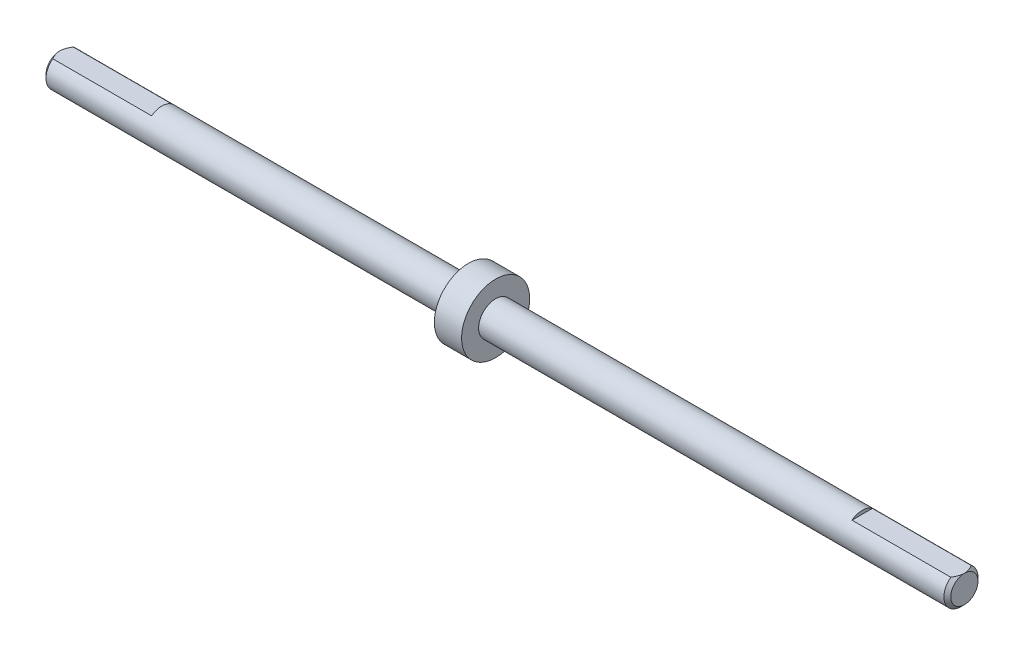
ISO-10303-21;
HEADER;
FILE_DESCRIPTION(('STEP AP214'),'2;1');
FILE_NAME('part.step','',(''),(''),'','','');
FILE_SCHEMA(('AUTOMOTIVE_DESIGN { 1 0 10303 214 1 1 1 1 }'));
ENDSEC;
DATA;
#1=APPLICATION_CONTEXT('core data for automotive mechanical design processes');
#2=APPLICATION_PROTOCOL_DEFINITION('international standard','automotive_design',2000,#1);
#3=PRODUCT_CONTEXT('',#1,'mechanical');
#4=PRODUCT('Part','Part','',(#3));
#5=PRODUCT_RELATED_PRODUCT_CATEGORY('part','',(#4));
#6=PRODUCT_DEFINITION_FORMATION('','',#4);
#7=PRODUCT_DEFINITION_CONTEXT('part definition',#1,'design');
#8=PRODUCT_DEFINITION('design','',#6,#7);
#9=PRODUCT_DEFINITION_SHAPE('','',#8);
#10=(LENGTH_UNIT() NAMED_UNIT(*) SI_UNIT(.MILLI.,.METRE.));
#11=(NAMED_UNIT(*) PLANE_ANGLE_UNIT() SI_UNIT($,.RADIAN.));
#12=(NAMED_UNIT(*) SI_UNIT($,.STERADIAN.) SOLID_ANGLE_UNIT());
#13=UNCERTAINTY_MEASURE_WITH_UNIT(LENGTH_MEASURE(1.E-05),#10,'distance_accuracy_value','');
#14=(GEOMETRIC_REPRESENTATION_CONTEXT(3) GLOBAL_UNCERTAINTY_ASSIGNED_CONTEXT((#13)) GLOBAL_UNIT_ASSIGNED_CONTEXT((#10,
#11,#12)) REPRESENTATION_CONTEXT('',''));
#15=CARTESIAN_POINT('',(0.,0.,0.));
#16=DIRECTION('',(0.,0.,1.));
#17=DIRECTION('',(1.,0.,0.));
#18=AXIS2_PLACEMENT_3D('',#15,#16,#17);
#19=CARTESIAN_POINT('',(9.,0.,0.));
#20=DIRECTION('',(-1.,0.,0.));
#21=DIRECTION('',(0.,0.,1.));
#22=AXIS2_PLACEMENT_3D('',#19,#20,#21);
#23=CYLINDRICAL_SURFACE('',#22,5.);
#24=CARTESIAN_POINT('',(9.,0.,0.));
#25=DIRECTION('',(-1.,0.,0.));
#26=DIRECTION('',(0.,0.,1.));
#27=AXIS2_PLACEMENT_3D('',#24,#25,#26);
#28=CIRCLE('',#27,5.);
#29=CARTESIAN_POINT('',(9.,0.,5.));
#30=VERTEX_POINT('',#29);
#31=EDGE_CURVE('E128',#30,#30,#28,.T.);
#32=ORIENTED_EDGE('',*,*,#31,.T.);
#33=EDGE_LOOP('',(#32));
#34=FACE_BOUND('',#33,.T.);
#35=CARTESIAN_POINT('',(5.,0.,0.));
#36=DIRECTION('',(-1.,0.,0.));
#37=DIRECTION('',(0.,0.,1.));
#38=AXIS2_PLACEMENT_3D('',#35,#36,#37);
#39=CIRCLE('',#38,5.);
#40=CARTESIAN_POINT('',(5.,0.,5.));
#41=VERTEX_POINT('',#40);
#42=EDGE_CURVE('E124',#41,#41,#39,.T.);
#43=ORIENTED_EDGE('',*,*,#42,.F.);
#44=EDGE_LOOP('',(#43));
#45=FACE_BOUND('',#44,.T.);
#46=ADVANCED_FACE('F41',(#34,#45),#23,.T.);
#47=CARTESIAN_POINT('',(9.,5.,0.));
#48=DIRECTION('',(1.,0.,0.));
#49=DIRECTION('',(0.,0.,-1.));
#50=AXIS2_PLACEMENT_3D('',#47,#48,#49);
#51=PLANE('',#50);
#52=CARTESIAN_POINT('',(9.,0.,0.));
#53=DIRECTION('',(1.,0.,0.));
#54=DIRECTION('',(0.,0.,-1.));
#55=AXIS2_PLACEMENT_3D('',#52,#53,#54);
#56=CIRCLE('',#55,2.5);
#57=CARTESIAN_POINT('',(9.,0.,-2.5));
#58=VERTEX_POINT('',#57);
#59=EDGE_CURVE('E116',#58,#58,#56,.T.);
#60=ORIENTED_EDGE('',*,*,#59,.F.);
#61=EDGE_LOOP('',(#60));
#62=FACE_BOUND('',#61,.T.);
#63=ORIENTED_EDGE('',*,*,#31,.F.);
#64=EDGE_LOOP('',(#63));
#65=FACE_BOUND('',#64,.T.);
#66=ADVANCED_FACE('F199',(#62,#65),#51,.T.);
#67=CARTESIAN_POINT('',(5.,0.,0.));
#68=DIRECTION('',(-1.,0.,0.));
#69=DIRECTION('',(0.,0.,1.));
#70=AXIS2_PLACEMENT_3D('',#67,#68,#69);
#71=PLANE('',#70);
#72=CARTESIAN_POINT('',(5.,0.,0.));
#73=DIRECTION('',(-1.,0.,0.));
#74=DIRECTION('',(0.,0.,1.));
#75=AXIS2_PLACEMENT_3D('',#72,#73,#74);
#76=CIRCLE('',#75,2.5);
#77=CARTESIAN_POINT('',(5.,0.,2.5));
#78=VERTEX_POINT('',#77);
#79=EDGE_CURVE('E112',#78,#78,#76,.T.);
#80=ORIENTED_EDGE('',*,*,#79,.F.);
#81=EDGE_LOOP('',(#80));
#82=FACE_BOUND('',#81,.T.);
#83=ORIENTED_EDGE('',*,*,#42,.T.);
#84=EDGE_LOOP('',(#83));
#85=FACE_BOUND('',#84,.T.);
#86=ADVANCED_FACE('F204',(#82,#85),#71,.T.);
#87=CARTESIAN_POINT('',(77.8,0.,0.));
#88=DIRECTION('',(-1.,0.,0.));
#89=DIRECTION('',(0.,0.,1.));
#90=AXIS2_PLACEMENT_3D('',#87,#88,#89);
#91=CYLINDRICAL_SURFACE('',#90,2.5);
#92=DIRECTION('',(1.,0.,0.));
#93=VECTOR('',#92,1.);
#94=CARTESIAN_POINT('',(62.8,2.,-1.5));
#95=LINE('',#94,#93);
#96=CARTESIAN_POINT('',(62.8,2.,-1.5));
#97=VERTEX_POINT('',#96);
#98=CARTESIAN_POINT('',(77.3,2.,-1.5));
#99=VERTEX_POINT('',#98);
#100=EDGE_CURVE('E122',#97,#99,#95,.T.);
#101=ORIENTED_EDGE('',*,*,#100,.T.);
#102=CARTESIAN_POINT('',(77.3,0.,0.));
#103=DIRECTION('',(1.,0.,0.));
#104=DIRECTION('',(0.,0.,-1.));
#105=AXIS2_PLACEMENT_3D('',#102,#103,#104);
#106=CIRCLE('',#105,2.5);
#107=CARTESIAN_POINT('',(77.3,2.,1.5));
#108=VERTEX_POINT('',#107);
#109=EDGE_CURVE('E11',#99,#108,#106,.F.);
#110=ORIENTED_EDGE('',*,*,#109,.T.);
#111=DIRECTION('',(1.,0.,0.));
#112=VECTOR('',#111,1.);
#113=CARTESIAN_POINT('',(62.8,2.,1.5));
#114=LINE('',#113,#112);
#115=CARTESIAN_POINT('',(62.8,2.,1.5));
#116=VERTEX_POINT('',#115);
#117=EDGE_CURVE('E121',#116,#108,#114,.T.);
#118=ORIENTED_EDGE('',*,*,#117,.F.);
#119=CARTESIAN_POINT('',(62.8,0.,0.));
#120=DIRECTION('',(1.,0.,0.));
#121=DIRECTION('',(0.,0.,-1.));
#122=AXIS2_PLACEMENT_3D('',#119,#120,#121);
#123=CIRCLE('',#122,2.5);
#124=EDGE_CURVE('E109',#97,#116,#123,.T.);
#125=ORIENTED_EDGE('',*,*,#124,.F.);
#126=EDGE_LOOP('',(#101,#110,#118,#125));
#127=FACE_BOUND('',#126,.T.);
#128=ORIENTED_EDGE('',*,*,#59,.T.);
#129=EDGE_LOOP('',(#128));
#130=FACE_BOUND('',#129,.T.);
#131=ADVANCED_FACE('F210',(#127,#130),#91,.T.);
#132=CARTESIAN_POINT('',(77.8,0.,0.));
#133=DIRECTION('',(1.,0.,0.));
#134=DIRECTION('',(0.,0.,-1.));
#135=AXIS2_PLACEMENT_3D('',#132,#133,#134);
#136=PLANE('',#135);
#137=CARTESIAN_POINT('',(77.8,0.,0.));
#138=DIRECTION('',(1.,0.,0.));
#139=DIRECTION('',(0.,0.,-1.));
#140=AXIS2_PLACEMENT_3D('',#137,#138,#139);
#141=CIRCLE('',#140,2.00000000000004);
#142=CARTESIAN_POINT('',(77.8,2.,0.));
#143=VERTEX_POINT('',#142);
#144=EDGE_CURVE('E185',#143,#143,#141,.T.);
#145=ORIENTED_EDGE('',*,*,#144,.T.);
#146=EDGE_LOOP('',(#145));
#147=FACE_BOUND('',#146,.T.);
#148=ADVANCED_FACE('F171',(#147),#136,.T.);
#149=CARTESIAN_POINT('',(62.8,2.,1.5));
#150=DIRECTION('',(0.,-1.,0.));
#151=DIRECTION('',(0.,0.,-1.));
#152=AXIS2_PLACEMENT_3D('',#149,#150,#151);
#153=PLANE('',#152);
#154=CARTESIAN_POINT('',(77.3,2.,1.5));
#155=CARTESIAN_POINT('',(77.3433736980276,2.,1.42763018659213));
#156=CARTESIAN_POINT('',(77.3853687019536,2.,1.35436226532258));
#157=CARTESIAN_POINT('',(77.4656443583189,2.,1.20549660628809));
#158=CARTESIAN_POINT('',(77.5039114197062,2.,1.12989157710706));
#159=CARTESIAN_POINT('',(77.574534191742,2.,0.978296734874838));
#160=CARTESIAN_POINT('',(77.6070165390548,2.,0.902366736266413));
#161=CARTESIAN_POINT('',(77.665809016699,2.,0.748220644904079));
#162=CARTESIAN_POINT('',(77.6921276624894,2.,0.670007876047711));
#163=CARTESIAN_POINT('',(77.7280861032667,2.,0.543060600019252));
#164=CARTESIAN_POINT('',(77.7401901027996,2.,0.495021163503649));
#165=CARTESIAN_POINT('',(77.7612794306282,2.,0.39826041921759));
#166=CARTESIAN_POINT('',(77.7702651517484,2.,0.349539198139864));
#167=CARTESIAN_POINT('',(77.7849271240241,2.,0.250852177401969));
#168=CARTESIAN_POINT('',(77.7905520018213,2.,0.20087865403864));
#169=CARTESIAN_POINT('',(77.7981023484678,2.,0.100607619276181));
#170=CARTESIAN_POINT('',(77.8000243314446,2.,0.0503098472705352));
#171=CARTESIAN_POINT('',(77.8,2.,0.));
#172=B_SPLINE_CURVE_WITH_KNOTS('',3,(#154,#155,#156,#157,#158,#159,#160,#161,#162,#163,#164,
#165,#166,#167,#168,#169,#170,#171),.UNSPECIFIED.,.F.,.F.,(4,2,2,2,2,2,2,2,4),(0.,
0.253195034695592,0.507281075974282,0.754837752612873,1.00205037282501,1.15058504578388,
1.29910100031796,1.44983263801685,1.60070610394699),.UNSPECIFIED.);
#173=EDGE_CURVE('E175',#108,#143,#172,.T.);
#174=ORIENTED_EDGE('',*,*,#173,.T.);
#175=CARTESIAN_POINT('',(77.8,2.00000000000004,0.));
#176=CARTESIAN_POINT('',(77.8000514930088,2.00000000000002,-0.0614966481035618));
#177=CARTESIAN_POINT('',(77.797164788165,2.,-0.122961796118779));
#178=CARTESIAN_POINT('',(77.7859212389057,2.,-0.245274670057056));
#179=CARTESIAN_POINT('',(77.7775750221521,2.,-0.306123362775475));
#180=CARTESIAN_POINT('',(77.7559969816614,2.,-0.425885509906886));
#181=CARTESIAN_POINT('',(77.7428488248966,2.,-0.484814317272303));
#182=CARTESIAN_POINT('',(77.7122507618696,2.,-0.601555526074523));
#183=CARTESIAN_POINT('',(77.6947990813251,2.,-0.659367456410741));
#184=CARTESIAN_POINT('',(77.6525702057821,2.,-0.784576263433297));
#185=CARTESIAN_POINT('',(77.6270315815753,2.,-0.85171451076064));
#186=CARTESIAN_POINT('',(77.5717452055525,2.,-0.984250024576899));
#187=CARTESIAN_POINT('',(77.5419954048129,2.,-1.04964642506794));
#188=CARTESIAN_POINT('',(77.4784785026746,2.,-1.18016546542204));
#189=CARTESIAN_POINT('',(77.4446394298057,2.,-1.24525271545218));
#190=CARTESIAN_POINT('',(77.3742160914668,2.,-1.37378197006117));
#191=CARTESIAN_POINT('',(77.3376367483736,2.,-1.43722666174301));
#192=CARTESIAN_POINT('',(77.3,2.,-1.5));
#193=B_SPLINE_CURVE_WITH_KNOTS('',3,(#175,#176,#177,#178,#179,#180,#181,#182,#183,#184,#185,
#186,#187,#188,#189,#190,#191,#192),.UNSPECIFIED.,.F.,.F.,(4,2,2,2,2,2,2,2,4),(0.,
0.184371949240822,0.36838605790703,0.549336051664283,0.730360773654871,0.945674044871372,
1.16109243790834,1.38109142427278,1.60070428639641),.UNSPECIFIED.);
#194=EDGE_CURVE('E51',#143,#99,#193,.T.);
#195=ORIENTED_EDGE('',*,*,#194,.T.);
#196=ORIENTED_EDGE('',*,*,#100,.F.);
#197=DIRECTION('',(0.,0.,-1.));
#198=VECTOR('',#197,1.);
#199=CARTESIAN_POINT('',(62.8,2.,1.5));
#200=LINE('',#199,#198);
#201=EDGE_CURVE('E118',#116,#97,#200,.T.);
#202=ORIENTED_EDGE('',*,*,#201,.F.);
#203=ORIENTED_EDGE('',*,*,#117,.T.);
#204=EDGE_LOOP('',(#174,#195,#196,#202,#203));
#205=FACE_BOUND('',#204,.T.);
#206=ADVANCED_FACE('F166',(#205),#153,.F.);
#207=CARTESIAN_POINT('',(62.8,0.,0.));
#208=DIRECTION('',(1.,0.,0.));
#209=DIRECTION('',(0.,0.,-1.));
#210=AXIS2_PLACEMENT_3D('',#207,#208,#209);
#211=PLANE('',#210);
#212=ORIENTED_EDGE('',*,*,#124,.T.);
#213=ORIENTED_EDGE('',*,*,#201,.T.);
#214=EDGE_LOOP('',(#212,#213));
#215=FACE_BOUND('',#214,.T.);
#216=ADVANCED_FACE('F163',(#215),#211,.T.);
#217=CARTESIAN_POINT('',(-55.,0.,0.));
#218=DIRECTION('',(1.,0.,0.));
#219=DIRECTION('',(0.,0.,-1.));
#220=AXIS2_PLACEMENT_3D('',#217,#218,#219);
#221=CYLINDRICAL_SURFACE('',#220,2.5);
#222=DIRECTION('',(-1.,0.,0.));
#223=VECTOR('',#222,1.);
#224=CARTESIAN_POINT('',(-40.,2.,1.5));
#225=LINE('',#224,#223);
#226=CARTESIAN_POINT('',(-40.,2.,1.5));
#227=VERTEX_POINT('',#226);
#228=CARTESIAN_POINT('',(-54.5,2.,1.5));
#229=VERTEX_POINT('',#228);
#230=EDGE_CURVE('E102',#227,#229,#225,.T.);
#231=ORIENTED_EDGE('',*,*,#230,.T.);
#232=CARTESIAN_POINT('',(-54.5,0.,0.));
#233=DIRECTION('',(-1.,0.,0.));
#234=DIRECTION('',(0.,0.,1.));
#235=AXIS2_PLACEMENT_3D('',#232,#233,#234);
#236=CIRCLE('',#235,2.5);
#237=CARTESIAN_POINT('',(-54.5,2.,-1.5));
#238=VERTEX_POINT('',#237);
#239=EDGE_CURVE('E107',#229,#238,#236,.F.);
#240=ORIENTED_EDGE('',*,*,#239,.T.);
#241=DIRECTION('',(-1.,0.,0.));
#242=VECTOR('',#241,1.);
#243=CARTESIAN_POINT('',(-40.,2.,-1.5));
#244=LINE('',#243,#242);
#245=CARTESIAN_POINT('',(-40.,2.,-1.5));
#246=VERTEX_POINT('',#245);
#247=EDGE_CURVE('E100',#246,#238,#244,.T.);
#248=ORIENTED_EDGE('',*,*,#247,.F.);
#249=CARTESIAN_POINT('',(-40.,0.,0.));
#250=DIRECTION('',(-1.,0.,0.));
#251=DIRECTION('',(0.,0.,1.));
#252=AXIS2_PLACEMENT_3D('',#249,#250,#251);
#253=CIRCLE('',#252,2.5);
#254=EDGE_CURVE('E88',#227,#246,#253,.T.);
#255=ORIENTED_EDGE('',*,*,#254,.F.);
#256=EDGE_LOOP('',(#231,#240,#248,#255));
#257=FACE_BOUND('',#256,.T.);
#258=ORIENTED_EDGE('',*,*,#79,.T.);
#259=EDGE_LOOP('',(#258));
#260=FACE_BOUND('',#259,.T.);
#261=ADVANCED_FACE('F104',(#257,#260),#221,.T.);
#262=CARTESIAN_POINT('',(-55.,0.,0.));
#263=DIRECTION('',(-1.,0.,0.));
#264=DIRECTION('',(0.,0.,1.));
#265=AXIS2_PLACEMENT_3D('',#262,#263,#264);
#266=PLANE('',#265);
#267=CARTESIAN_POINT('',(-55.,0.,0.));
#268=DIRECTION('',(-1.,0.,0.));
#269=DIRECTION('',(0.,0.,1.));
#270=AXIS2_PLACEMENT_3D('',#267,#268,#269);
#271=CIRCLE('',#270,2.);
#272=CARTESIAN_POINT('',(-55.,2.,0.));
#273=VERTEX_POINT('',#272);
#274=EDGE_CURVE('E115',#273,#273,#271,.T.);
#275=ORIENTED_EDGE('',*,*,#274,.T.);
#276=EDGE_LOOP('',(#275));
#277=FACE_BOUND('',#276,.T.);
#278=ADVANCED_FACE('F156',(#277),#266,.T.);
#279=CARTESIAN_POINT('',(-40.,2.,-1.5));
#280=DIRECTION('',(0.,-1.,0.));
#281=DIRECTION('',(0.,0.,-1.));
#282=AXIS2_PLACEMENT_3D('',#279,#280,#281);
#283=PLANE('',#282);
#284=CARTESIAN_POINT('',(-54.5,2.,-1.5));
#285=CARTESIAN_POINT('',(-54.5433736980276,2.,-1.42763018659214));
#286=CARTESIAN_POINT('',(-54.5853687019536,2.,-1.35436226532258));
#287=CARTESIAN_POINT('',(-54.6656443583189,2.,-1.20549660628809));
#288=CARTESIAN_POINT('',(-54.7039114197061,2.,-1.12989157710705));
#289=CARTESIAN_POINT('',(-54.774534191742,2.,-0.978296734874841));
#290=CARTESIAN_POINT('',(-54.8070165390548,2.,-0.90236673626642));
#291=CARTESIAN_POINT('',(-54.8658090166989,2.,-0.748220644904089));
#292=CARTESIAN_POINT('',(-54.8921276624893,2.,-0.67000787604772));
#293=CARTESIAN_POINT('',(-54.9280861032667,2.,-0.543060600019261));
#294=CARTESIAN_POINT('',(-54.9401901027996,2.,-0.495021163503659));
#295=CARTESIAN_POINT('',(-54.9612794306282,2.,-0.398260419217596));
#296=CARTESIAN_POINT('',(-54.9702651517484,2.,-0.349539198139867));
#297=CARTESIAN_POINT('',(-54.984927124024,2.,-0.250852177401967));
#298=CARTESIAN_POINT('',(-54.9905520018212,2.,-0.200878654038636));
#299=CARTESIAN_POINT('',(-54.9981023484678,2.,-0.100607619276174));
#300=CARTESIAN_POINT('',(-55.0000243314446,2.,-0.0503098472705274));
#301=CARTESIAN_POINT('',(-55.,2.,0.));
#302=B_SPLINE_CURVE_WITH_KNOTS('',3,(#284,#285,#286,#287,#288,#289,#290,#291,#292,#293,#294,
#295,#296,#297,#298,#299,#300,#301),.UNSPECIFIED.,.F.,.F.,(4,2,2,2,2,2,2,2,4),(0.,
0.253195034695591,0.507281075974278,0.754837752612864,1.002050372825,1.15058504578387,
1.29910100031796,1.44983263801686,1.600706103947),.UNSPECIFIED.);
#303=EDGE_CURVE('E135',#238,#273,#302,.T.);
#304=ORIENTED_EDGE('',*,*,#303,.T.);
#305=CARTESIAN_POINT('',(-55.,2.,0.));
#306=CARTESIAN_POINT('',(-55.0000514930088,2.,0.0614966481035605));
#307=CARTESIAN_POINT('',(-54.997164788165,2.,0.122961796118776));
#308=CARTESIAN_POINT('',(-54.9859212389057,2.,0.245274670057052));
#309=CARTESIAN_POINT('',(-54.9775750221521,2.,0.306123362775471));
#310=CARTESIAN_POINT('',(-54.9559969816614,2.,0.425885509906882));
#311=CARTESIAN_POINT('',(-54.9428488248966,2.,0.484814317272298));
#312=CARTESIAN_POINT('',(-54.9122507618696,2.,0.60155552607452));
#313=CARTESIAN_POINT('',(-54.8947990813251,2.,0.659367456410738));
#314=CARTESIAN_POINT('',(-54.8525702057821,2.,0.784576263433297));
#315=CARTESIAN_POINT('',(-54.8270315815753,2.,0.851714510760641));
#316=CARTESIAN_POINT('',(-54.7717452055525,2.,0.9842500245769));
#317=CARTESIAN_POINT('',(-54.7419954048129,2.,1.04964642506794));
#318=CARTESIAN_POINT('',(-54.6784785026746,2.,1.18016546542205));
#319=CARTESIAN_POINT('',(-54.6446394298057,2.,1.24525271545218));
#320=CARTESIAN_POINT('',(-54.5742160914667,2.,1.37378197006118));
#321=CARTESIAN_POINT('',(-54.5376367483736,2.,1.43722666174301));
#322=CARTESIAN_POINT('',(-54.5,2.,1.5));
#323=B_SPLINE_CURVE_WITH_KNOTS('',3,(#305,#306,#307,#308,#309,#310,#311,#312,#313,#314,#315,
#316,#317,#318,#319,#320,#321,#322),.UNSPECIFIED.,.F.,.F.,(4,2,2,2,2,2,2,2,4),(0.,
0.18437194924082,0.368386057907028,0.549336051664282,0.730360773654868,0.94567404487138,
1.16109243790834,1.38109142427279,1.60070428639642),.UNSPECIFIED.);
#324=EDGE_CURVE('E142',#273,#229,#323,.T.);
#325=ORIENTED_EDGE('',*,*,#324,.T.);
#326=ORIENTED_EDGE('',*,*,#230,.F.);
#327=DIRECTION('',(0.,0.,1.));
#328=VECTOR('',#327,1.);
#329=CARTESIAN_POINT('',(-40.,2.,-1.5));
#330=LINE('',#329,#328);
#331=EDGE_CURVE('E91',#246,#227,#330,.T.);
#332=ORIENTED_EDGE('',*,*,#331,.F.);
#333=ORIENTED_EDGE('',*,*,#247,.T.);
#334=EDGE_LOOP('',(#304,#325,#326,#332,#333));
#335=FACE_BOUND('',#334,.T.);
#336=ADVANCED_FACE('F99',(#335),#283,.F.);
#337=CARTESIAN_POINT('',(-40.,0.,0.));
#338=DIRECTION('',(-1.,0.,0.));
#339=DIRECTION('',(0.,0.,1.));
#340=AXIS2_PLACEMENT_3D('',#337,#338,#339);
#341=PLANE('',#340);
#342=ORIENTED_EDGE('',*,*,#254,.T.);
#343=ORIENTED_EDGE('',*,*,#331,.T.);
#344=EDGE_LOOP('',(#342,#343));
#345=FACE_BOUND('',#344,.T.);
#346=ADVANCED_FACE('F90',(#345),#341,.T.);
#347=CARTESIAN_POINT('',(-55.,0.,0.));
#348=DIRECTION('',(1.,0.,0.));
#349=DIRECTION('',(0.,0.,-1.));
#350=AXIS2_PLACEMENT_3D('',#347,#348,#349);
#351=CONICAL_SURFACE('',#350,2.,0.785398163397432);
#352=ORIENTED_EDGE('',*,*,#303,.F.);
#353=ORIENTED_EDGE('',*,*,#239,.F.);
#354=ORIENTED_EDGE('',*,*,#324,.F.);
#355=ORIENTED_EDGE('',*,*,#274,.F.);
#356=EDGE_LOOP('',(#352,#353,#354,#355));
#357=FACE_BOUND('',#356,.T.);
#358=ADVANCED_FACE('F149',(#357),#351,.T.);
#359=CARTESIAN_POINT('',(77.8,0.,0.));
#360=DIRECTION('',(-1.,0.,0.));
#361=DIRECTION('',(0.,0.,1.));
#362=AXIS2_PLACEMENT_3D('',#359,#360,#361);
#363=CONICAL_SURFACE('',#362,2.00000000000004,0.785398163397433);
#364=ORIENTED_EDGE('',*,*,#173,.F.);
#365=ORIENTED_EDGE('',*,*,#109,.F.);
#366=ORIENTED_EDGE('',*,*,#194,.F.);
#367=ORIENTED_EDGE('',*,*,#144,.F.);
#368=EDGE_LOOP('',(#364,#365,#366,#367));
#369=FACE_BOUND('',#368,.T.);
#370=ADVANCED_FACE('F44',(#369),#363,.T.);
#371=CLOSED_SHELL('',(#46,#66,#86,#131,#148,#206,#216,#261,#278,#336,#346,#358,#370));
#372=MANIFOLD_SOLID_BREP('B2',#371);
#373=ADVANCED_BREP_SHAPE_REPRESENTATION('',(#18,#372),#14);
#374=SHAPE_DEFINITION_REPRESENTATION(#9,#373);
ENDSEC;
END-ISO-10303-21;
